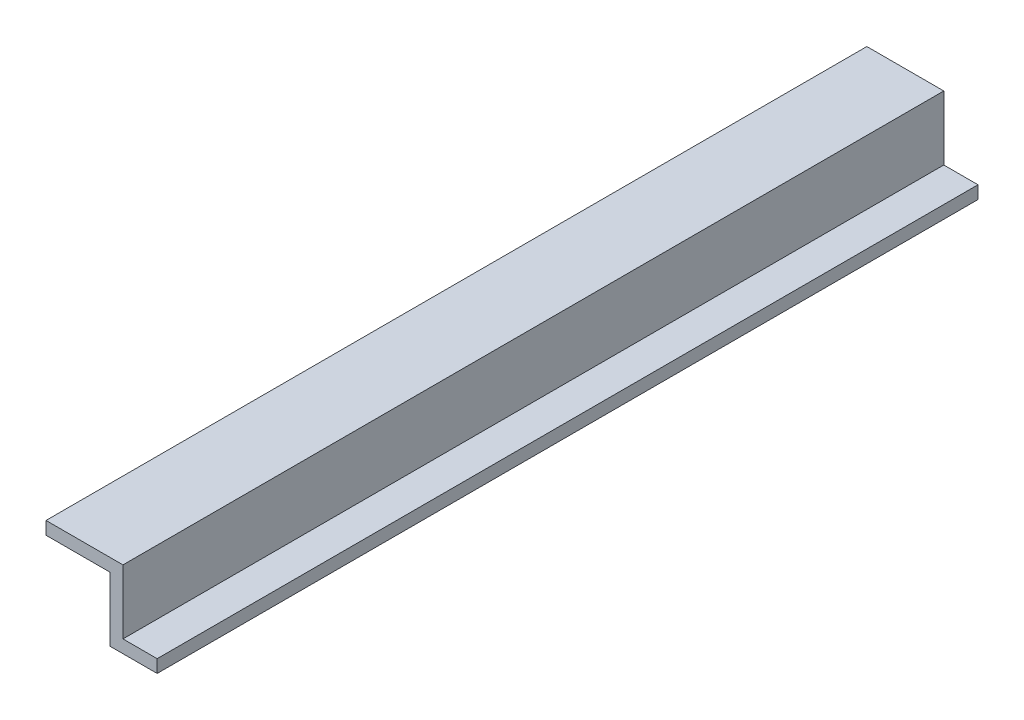
ISO-10303-21;
HEADER;
FILE_DESCRIPTION(('STEP AP214'),'2;1');
FILE_NAME('part.step','',(''),(''),'','','');
FILE_SCHEMA(('AUTOMOTIVE_DESIGN { 1 0 10303 214 1 1 1 1 }'));
ENDSEC;
DATA;
#1=APPLICATION_CONTEXT('core data for automotive mechanical design processes');
#2=APPLICATION_PROTOCOL_DEFINITION('international standard','automotive_design',2000,#1);
#3=PRODUCT_CONTEXT('',#1,'mechanical');
#4=PRODUCT('Part','Part','',(#3));
#5=PRODUCT_RELATED_PRODUCT_CATEGORY('part','',(#4));
#6=PRODUCT_DEFINITION_FORMATION('','',#4);
#7=PRODUCT_DEFINITION_CONTEXT('part definition',#1,'design');
#8=PRODUCT_DEFINITION('design','',#6,#7);
#9=PRODUCT_DEFINITION_SHAPE('','',#8);
#10=(LENGTH_UNIT() NAMED_UNIT(*) SI_UNIT(.MILLI.,.METRE.));
#11=(NAMED_UNIT(*) PLANE_ANGLE_UNIT() SI_UNIT($,.RADIAN.));
#12=(NAMED_UNIT(*) SI_UNIT($,.STERADIAN.) SOLID_ANGLE_UNIT());
#13=UNCERTAINTY_MEASURE_WITH_UNIT(LENGTH_MEASURE(1.E-05),#10,'distance_accuracy_value','');
#14=(GEOMETRIC_REPRESENTATION_CONTEXT(3) GLOBAL_UNCERTAINTY_ASSIGNED_CONTEXT((#13)) GLOBAL_UNIT_ASSIGNED_CONTEXT((#10,
#11,#12)) REPRESENTATION_CONTEXT('',''));
#15=CARTESIAN_POINT('',(0.,0.,0.));
#16=DIRECTION('',(0.,0.,1.));
#17=DIRECTION('',(1.,0.,0.));
#18=AXIS2_PLACEMENT_3D('',#15,#16,#17);
#19=CARTESIAN_POINT('',(2.38125,-9.525,152.4));
#20=DIRECTION('',(0.,-1.,0.));
#21=DIRECTION('',(0.,0.,-1.));
#22=AXIS2_PLACEMENT_3D('',#19,#20,#21);
#23=PLANE('',#22);
#24=DIRECTION('',(0.,0.,-1.));
#25=VECTOR('',#24,1.);
#26=CARTESIAN_POINT('',(15.08125,-9.525,152.4));
#27=LINE('',#26,#25);
#28=CARTESIAN_POINT('',(15.08125,-9.525,152.4));
#29=VERTEX_POINT('',#28);
#30=CARTESIAN_POINT('',(15.08125,-9.525,-152.4));
#31=VERTEX_POINT('',#30);
#32=EDGE_CURVE('E125',#29,#31,#27,.T.);
#33=ORIENTED_EDGE('',*,*,#32,.T.);
#34=DIRECTION('',(-1.,0.,0.));
#35=VECTOR('',#34,1.);
#36=CARTESIAN_POINT('',(2.38125,-9.525,-152.4));
#37=LINE('',#36,#35);
#38=CARTESIAN_POINT('',(2.38125,-9.525,-152.4));
#39=VERTEX_POINT('',#38);
#40=EDGE_CURVE('E119',#31,#39,#37,.T.);
#41=ORIENTED_EDGE('',*,*,#40,.T.);
#42=DIRECTION('',(0.,0.,-1.));
#43=VECTOR('',#42,1.);
#44=CARTESIAN_POINT('',(2.38125,-9.525,152.4));
#45=LINE('',#44,#43);
#46=CARTESIAN_POINT('',(2.38125,-9.525,152.4));
#47=VERTEX_POINT('',#46);
#48=EDGE_CURVE('E11',#47,#39,#45,.T.);
#49=ORIENTED_EDGE('',*,*,#48,.F.);
#50=DIRECTION('',(-1.,0.,0.));
#51=VECTOR('',#50,1.);
#52=CARTESIAN_POINT('',(2.38125,-9.525,152.4));
#53=LINE('',#52,#51);
#54=EDGE_CURVE('E143',#29,#47,#53,.T.);
#55=ORIENTED_EDGE('',*,*,#54,.F.);
#56=EDGE_LOOP('',(#33,#41,#49,#55));
#57=FACE_BOUND('',#56,.T.);
#58=ADVANCED_FACE('F43',(#57),#23,.F.);
#59=CARTESIAN_POINT('',(2.38125,-9.525,152.4));
#60=DIRECTION('',(-1.,0.,0.));
#61=DIRECTION('',(0.,0.,1.));
#62=AXIS2_PLACEMENT_3D('',#59,#60,#61);
#63=PLANE('',#62);
#64=ORIENTED_EDGE('',*,*,#48,.T.);
#65=DIRECTION('',(0.,1.,0.));
#66=VECTOR('',#65,1.);
#67=CARTESIAN_POINT('',(2.38125,-9.525,-152.4));
#68=LINE('',#67,#66);
#69=CARTESIAN_POINT('',(2.38125,14.2875,-152.4));
#70=VERTEX_POINT('',#69);
#71=EDGE_CURVE('E109',#39,#70,#68,.T.);
#72=ORIENTED_EDGE('',*,*,#71,.T.);
#73=DIRECTION('',(0.,0.,-1.));
#74=VECTOR('',#73,1.);
#75=CARTESIAN_POINT('',(2.38125,14.2875,152.4));
#76=LINE('',#75,#74);
#77=CARTESIAN_POINT('',(2.38125,14.2875,152.4));
#78=VERTEX_POINT('',#77);
#79=EDGE_CURVE('E50',#78,#70,#76,.T.);
#80=ORIENTED_EDGE('',*,*,#79,.F.);
#81=DIRECTION('',(0.,1.,0.));
#82=VECTOR('',#81,1.);
#83=CARTESIAN_POINT('',(2.38125,-9.525,152.4));
#84=LINE('',#83,#82);
#85=EDGE_CURVE('E110',#47,#78,#84,.T.);
#86=ORIENTED_EDGE('',*,*,#85,.F.);
#87=EDGE_LOOP('',(#64,#72,#80,#86));
#88=FACE_BOUND('',#87,.T.);
#89=ADVANCED_FACE('F107',(#88),#63,.F.);
#90=CARTESIAN_POINT('',(2.38125,14.2875,152.4));
#91=DIRECTION('',(0.,-1.,0.));
#92=DIRECTION('',(0.,0.,-1.));
#93=AXIS2_PLACEMENT_3D('',#90,#91,#92);
#94=PLANE('',#93);
#95=ORIENTED_EDGE('',*,*,#79,.T.);
#96=DIRECTION('',(-1.,0.,0.));
#97=VECTOR('',#96,1.);
#98=CARTESIAN_POINT('',(2.38125,14.2875,-152.4));
#99=LINE('',#98,#97);
#100=CARTESIAN_POINT('',(-26.19375,14.2875,-152.4));
#101=VERTEX_POINT('',#100);
#102=EDGE_CURVE('E123',#70,#101,#99,.T.);
#103=ORIENTED_EDGE('',*,*,#102,.T.);
#104=DIRECTION('',(0.,0.,-1.));
#105=VECTOR('',#104,1.);
#106=CARTESIAN_POINT('',(-26.19375,14.2875,152.4));
#107=LINE('',#106,#105);
#108=CARTESIAN_POINT('',(-26.19375,14.2875,152.4));
#109=VERTEX_POINT('',#108);
#110=EDGE_CURVE('E165',#109,#101,#107,.T.);
#111=ORIENTED_EDGE('',*,*,#110,.F.);
#112=DIRECTION('',(-1.,0.,0.));
#113=VECTOR('',#112,1.);
#114=CARTESIAN_POINT('',(2.38125,14.2875,152.4));
#115=LINE('',#114,#113);
#116=EDGE_CURVE('E146',#78,#109,#115,.T.);
#117=ORIENTED_EDGE('',*,*,#116,.F.);
#118=EDGE_LOOP('',(#95,#103,#111,#117));
#119=FACE_BOUND('',#118,.T.);
#120=ADVANCED_FACE('F168',(#119),#94,.F.);
#121=CARTESIAN_POINT('',(-26.19375,14.2875,152.4));
#122=DIRECTION('',(1.,0.,0.));
#123=DIRECTION('',(0.,0.,-1.));
#124=AXIS2_PLACEMENT_3D('',#121,#122,#123);
#125=PLANE('',#124);
#126=ORIENTED_EDGE('',*,*,#110,.T.);
#127=DIRECTION('',(0.,-1.,0.));
#128=VECTOR('',#127,1.);
#129=CARTESIAN_POINT('',(-26.19375,14.2875,-152.4));
#130=LINE('',#129,#128);
#131=CARTESIAN_POINT('',(-26.19375,9.525,-152.4));
#132=VERTEX_POINT('',#131);
#133=EDGE_CURVE('E129',#101,#132,#130,.T.);
#134=ORIENTED_EDGE('',*,*,#133,.T.);
#135=DIRECTION('',(0.,0.,-1.));
#136=VECTOR('',#135,1.);
#137=CARTESIAN_POINT('',(-26.19375,9.525,152.4));
#138=LINE('',#137,#136);
#139=CARTESIAN_POINT('',(-26.19375,9.525,152.4));
#140=VERTEX_POINT('',#139);
#141=EDGE_CURVE('E163',#140,#132,#138,.T.);
#142=ORIENTED_EDGE('',*,*,#141,.F.);
#143=DIRECTION('',(0.,-1.,0.));
#144=VECTOR('',#143,1.);
#145=CARTESIAN_POINT('',(-26.19375,14.2875,152.4));
#146=LINE('',#145,#144);
#147=EDGE_CURVE('E148',#109,#140,#146,.T.);
#148=ORIENTED_EDGE('',*,*,#147,.F.);
#149=EDGE_LOOP('',(#126,#134,#142,#148));
#150=FACE_BOUND('',#149,.T.);
#151=ADVANCED_FACE('F176',(#150),#125,.F.);
#152=CARTESIAN_POINT('',(-2.38125,9.525,152.4));
#153=DIRECTION('',(0.,1.,0.));
#154=DIRECTION('',(0.,0.,1.));
#155=AXIS2_PLACEMENT_3D('',#152,#153,#154);
#156=PLANE('',#155);
#157=ORIENTED_EDGE('',*,*,#141,.T.);
#158=DIRECTION('',(1.,0.,0.));
#159=VECTOR('',#158,1.);
#160=CARTESIAN_POINT('',(-2.38125,9.525,-152.4));
#161=LINE('',#160,#159);
#162=CARTESIAN_POINT('',(-2.38125,9.525,-152.4));
#163=VERTEX_POINT('',#162);
#164=EDGE_CURVE('E132',#132,#163,#161,.T.);
#165=ORIENTED_EDGE('',*,*,#164,.T.);
#166=DIRECTION('',(0.,0.,-1.));
#167=VECTOR('',#166,1.);
#168=CARTESIAN_POINT('',(-2.38125,9.525,152.4));
#169=LINE('',#168,#167);
#170=CARTESIAN_POINT('',(-2.38125,9.525,152.4));
#171=VERTEX_POINT('',#170);
#172=EDGE_CURVE('E161',#171,#163,#169,.T.);
#173=ORIENTED_EDGE('',*,*,#172,.F.);
#174=DIRECTION('',(1.,0.,0.));
#175=VECTOR('',#174,1.);
#176=CARTESIAN_POINT('',(-2.38125,9.525,152.4));
#177=LINE('',#176,#175);
#178=EDGE_CURVE('E150',#140,#171,#177,.T.);
#179=ORIENTED_EDGE('',*,*,#178,.F.);
#180=EDGE_LOOP('',(#157,#165,#173,#179));
#181=FACE_BOUND('',#180,.T.);
#182=ADVANCED_FACE('F179',(#181),#156,.F.);
#183=CARTESIAN_POINT('',(-2.38125,-14.2875,152.4));
#184=DIRECTION('',(1.,0.,0.));
#185=DIRECTION('',(0.,0.,-1.));
#186=AXIS2_PLACEMENT_3D('',#183,#184,#185);
#187=PLANE('',#186);
#188=ORIENTED_EDGE('',*,*,#172,.T.);
#189=DIRECTION('',(0.,-1.,0.));
#190=VECTOR('',#189,1.);
#191=CARTESIAN_POINT('',(-2.38125,-14.2875,-152.4));
#192=LINE('',#191,#190);
#193=CARTESIAN_POINT('',(-2.38125,-14.2875,-152.4));
#194=VERTEX_POINT('',#193);
#195=EDGE_CURVE('E135',#163,#194,#192,.T.);
#196=ORIENTED_EDGE('',*,*,#195,.T.);
#197=DIRECTION('',(0.,0.,-1.));
#198=VECTOR('',#197,1.);
#199=CARTESIAN_POINT('',(-2.38125,-14.2875,152.4));
#200=LINE('',#199,#198);
#201=CARTESIAN_POINT('',(-2.38125,-14.2875,152.4));
#202=VERTEX_POINT('',#201);
#203=EDGE_CURVE('E159',#202,#194,#200,.T.);
#204=ORIENTED_EDGE('',*,*,#203,.F.);
#205=DIRECTION('',(0.,-1.,0.));
#206=VECTOR('',#205,1.);
#207=CARTESIAN_POINT('',(-2.38125,-14.2875,152.4));
#208=LINE('',#207,#206);
#209=EDGE_CURVE('E152',#171,#202,#208,.T.);
#210=ORIENTED_EDGE('',*,*,#209,.F.);
#211=EDGE_LOOP('',(#188,#196,#204,#210));
#212=FACE_BOUND('',#211,.T.);
#213=ADVANCED_FACE('F184',(#212),#187,.F.);
#214=CARTESIAN_POINT('',(-2.38125,-14.2875,152.4));
#215=DIRECTION('',(0.,1.,0.));
#216=DIRECTION('',(0.,0.,1.));
#217=AXIS2_PLACEMENT_3D('',#214,#215,#216);
#218=PLANE('',#217);
#219=ORIENTED_EDGE('',*,*,#203,.T.);
#220=DIRECTION('',(1.,0.,0.));
#221=VECTOR('',#220,1.);
#222=CARTESIAN_POINT('',(-2.38125,-14.2875,-152.4));
#223=LINE('',#222,#221);
#224=CARTESIAN_POINT('',(15.08125,-14.2875,-152.4));
#225=VERTEX_POINT('',#224);
#226=EDGE_CURVE('E138',#194,#225,#223,.T.);
#227=ORIENTED_EDGE('',*,*,#226,.T.);
#228=DIRECTION('',(0.,0.,-1.));
#229=VECTOR('',#228,1.);
#230=CARTESIAN_POINT('',(15.08125,-14.2875,152.4));
#231=LINE('',#230,#229);
#232=CARTESIAN_POINT('',(15.08125,-14.2875,152.4));
#233=VERTEX_POINT('',#232);
#234=EDGE_CURVE('E157',#233,#225,#231,.T.);
#235=ORIENTED_EDGE('',*,*,#234,.F.);
#236=DIRECTION('',(1.,0.,0.));
#237=VECTOR('',#236,1.);
#238=CARTESIAN_POINT('',(-2.38125,-14.2875,152.4));
#239=LINE('',#238,#237);
#240=EDGE_CURVE('E62',#202,#233,#239,.T.);
#241=ORIENTED_EDGE('',*,*,#240,.F.);
#242=EDGE_LOOP('',(#219,#227,#235,#241));
#243=FACE_BOUND('',#242,.T.);
#244=ADVANCED_FACE('F187',(#243),#218,.F.);
#245=CARTESIAN_POINT('',(15.08125,-9.525,152.4));
#246=DIRECTION('',(-1.,0.,0.));
#247=DIRECTION('',(0.,0.,1.));
#248=AXIS2_PLACEMENT_3D('',#245,#246,#247);
#249=PLANE('',#248);
#250=ORIENTED_EDGE('',*,*,#234,.T.);
#251=DIRECTION('',(0.,1.,0.));
#252=VECTOR('',#251,1.);
#253=CARTESIAN_POINT('',(15.08125,-9.525,-152.4));
#254=LINE('',#253,#252);
#255=EDGE_CURVE('E141',#225,#31,#254,.T.);
#256=ORIENTED_EDGE('',*,*,#255,.T.);
#257=ORIENTED_EDGE('',*,*,#32,.F.);
#258=DIRECTION('',(0.,1.,0.));
#259=VECTOR('',#258,1.);
#260=CARTESIAN_POINT('',(15.08125,-9.525,152.4));
#261=LINE('',#260,#259);
#262=EDGE_CURVE('E57',#233,#29,#261,.T.);
#263=ORIENTED_EDGE('',*,*,#262,.F.);
#264=EDGE_LOOP('',(#250,#256,#257,#263));
#265=FACE_BOUND('',#264,.T.);
#266=ADVANCED_FACE('F189',(#265),#249,.F.);
#267=CARTESIAN_POINT('',(0.,0.,152.4));
#268=DIRECTION('',(0.,0.,-1.));
#269=DIRECTION('',(-1.,0.,0.));
#270=AXIS2_PLACEMENT_3D('',#267,#268,#269);
#271=PLANE('',#270);
#272=ORIENTED_EDGE('',*,*,#54,.T.);
#273=ORIENTED_EDGE('',*,*,#85,.T.);
#274=ORIENTED_EDGE('',*,*,#116,.T.);
#275=ORIENTED_EDGE('',*,*,#147,.T.);
#276=ORIENTED_EDGE('',*,*,#178,.T.);
#277=ORIENTED_EDGE('',*,*,#209,.T.);
#278=ORIENTED_EDGE('',*,*,#240,.T.);
#279=ORIENTED_EDGE('',*,*,#262,.T.);
#280=EDGE_LOOP('',(#272,#273,#274,#275,#276,#277,#278,#279));
#281=FACE_BOUND('',#280,.T.);
#282=ADVANCED_FACE('F171',(#281),#271,.F.);
#283=CARTESIAN_POINT('',(0.,0.,-152.4));
#284=DIRECTION('',(0.,0.,-1.));
#285=DIRECTION('',(-1.,0.,0.));
#286=AXIS2_PLACEMENT_3D('',#283,#284,#285);
#287=PLANE('',#286);
#288=ORIENTED_EDGE('',*,*,#40,.F.);
#289=ORIENTED_EDGE('',*,*,#255,.F.);
#290=ORIENTED_EDGE('',*,*,#226,.F.);
#291=ORIENTED_EDGE('',*,*,#195,.F.);
#292=ORIENTED_EDGE('',*,*,#164,.F.);
#293=ORIENTED_EDGE('',*,*,#133,.F.);
#294=ORIENTED_EDGE('',*,*,#102,.F.);
#295=ORIENTED_EDGE('',*,*,#71,.F.);
#296=EDGE_LOOP('',(#288,#289,#290,#291,#292,#293,#294,#295));
#297=FACE_BOUND('',#296,.T.);
#298=ADVANCED_FACE('F117',(#297),#287,.T.);
#299=CLOSED_SHELL('',(#58,#89,#120,#151,#182,#213,#244,#266,#282,#298));
#300=MANIFOLD_SOLID_BREP('B2',#299);
#301=ADVANCED_BREP_SHAPE_REPRESENTATION('',(#18,#300),#14);
#302=SHAPE_DEFINITION_REPRESENTATION(#9,#301);
ENDSEC;
END-ISO-10303-21;
